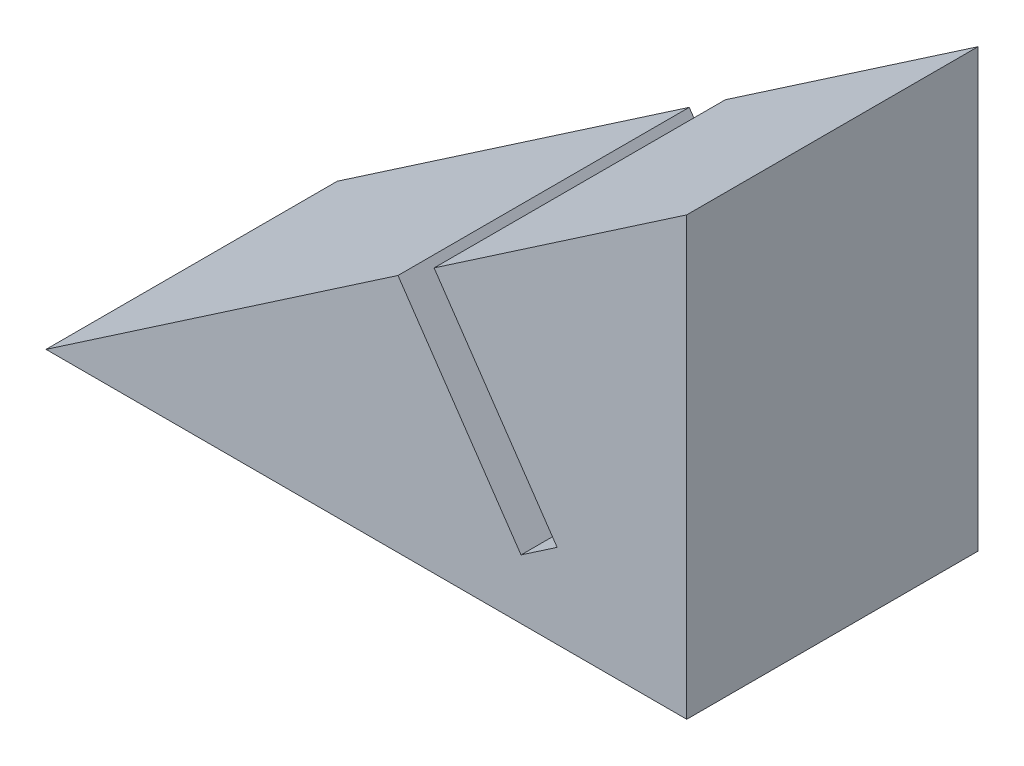
ISO-10303-21;
HEADER;
FILE_DESCRIPTION(('STEP AP214'),'2;1');
FILE_NAME('part.step','',(''),(''),'','','');
FILE_SCHEMA(('AUTOMOTIVE_DESIGN { 1 0 10303 214 1 1 1 1 }'));
ENDSEC;
DATA;
#1=APPLICATION_CONTEXT('core data for automotive mechanical design processes');
#2=APPLICATION_PROTOCOL_DEFINITION('international standard','automotive_design',2000,#1);
#3=PRODUCT_CONTEXT('',#1,'mechanical');
#4=PRODUCT('Part','Part','',(#3));
#5=PRODUCT_RELATED_PRODUCT_CATEGORY('part','',(#4));
#6=PRODUCT_DEFINITION_FORMATION('','',#4);
#7=PRODUCT_DEFINITION_CONTEXT('part definition',#1,'design');
#8=PRODUCT_DEFINITION('design','',#6,#7);
#9=PRODUCT_DEFINITION_SHAPE('','',#8);
#10=(LENGTH_UNIT() NAMED_UNIT(*) SI_UNIT(.MILLI.,.METRE.));
#11=(NAMED_UNIT(*) PLANE_ANGLE_UNIT() SI_UNIT($,.RADIAN.));
#12=(NAMED_UNIT(*) SI_UNIT($,.STERADIAN.) SOLID_ANGLE_UNIT());
#13=UNCERTAINTY_MEASURE_WITH_UNIT(LENGTH_MEASURE(1.E-05),#10,'distance_accuracy_value','');
#14=(GEOMETRIC_REPRESENTATION_CONTEXT(3) GLOBAL_UNCERTAINTY_ASSIGNED_CONTEXT((#13)) GLOBAL_UNIT_ASSIGNED_CONTEXT((#10,
#11,#12)) REPRESENTATION_CONTEXT('',''));
#15=CARTESIAN_POINT('',(0.,0.,0.));
#16=DIRECTION('',(0.,0.,1.));
#17=DIRECTION('',(1.,0.,0.));
#18=AXIS2_PLACEMENT_3D('',#15,#16,#17);
#19=CARTESIAN_POINT('',(-22.,0.,10.));
#20=DIRECTION('',(0.,1.,0.));
#21=DIRECTION('',(0.,0.,1.));
#22=AXIS2_PLACEMENT_3D('',#19,#20,#21);
#23=PLANE('',#22);
#24=DIRECTION('',(1.,0.,0.));
#25=VECTOR('',#24,1.);
#26=CARTESIAN_POINT('',(-22.,0.,0.));
#27=LINE('',#26,#25);
#28=CARTESIAN_POINT('',(-22.,0.,0.));
#29=VERTEX_POINT('',#28);
#30=CARTESIAN_POINT('',(0.,0.,0.));
#31=VERTEX_POINT('',#30);
#32=EDGE_CURVE('E134',#29,#31,#27,.T.);
#33=ORIENTED_EDGE('',*,*,#32,.T.);
#34=DIRECTION('',(0.,0.,-1.));
#35=VECTOR('',#34,1.);
#36=CARTESIAN_POINT('',(0.,0.,10.));
#37=LINE('',#36,#35);
#38=CARTESIAN_POINT('',(0.,0.,10.));
#39=VERTEX_POINT('',#38);
#40=EDGE_CURVE('E11',#39,#31,#37,.T.);
#41=ORIENTED_EDGE('',*,*,#40,.F.);
#42=DIRECTION('',(1.,0.,0.));
#43=VECTOR('',#42,1.);
#44=CARTESIAN_POINT('',(-22.,0.,10.));
#45=LINE('',#44,#43);
#46=CARTESIAN_POINT('',(-22.,0.,10.));
#47=VERTEX_POINT('',#46);
#48=EDGE_CURVE('E153',#47,#39,#45,.T.);
#49=ORIENTED_EDGE('',*,*,#48,.F.);
#50=DIRECTION('',(0.,0.,-1.));
#51=VECTOR('',#50,1.);
#52=CARTESIAN_POINT('',(-22.,0.,10.));
#53=LINE('',#52,#51);
#54=EDGE_CURVE('E130',#47,#29,#53,.T.);
#55=ORIENTED_EDGE('',*,*,#54,.T.);
#56=EDGE_LOOP('',(#33,#41,#49,#55));
#57=FACE_BOUND('',#56,.T.);
#58=ADVANCED_FACE('F39',(#57),#23,.F.);
#59=CARTESIAN_POINT('',(0.,0.,10.));
#60=DIRECTION('',(-1.,0.,0.));
#61=DIRECTION('',(0.,0.,1.));
#62=AXIS2_PLACEMENT_3D('',#59,#60,#61);
#63=PLANE('',#62);
#64=DIRECTION('',(0.,1.,0.));
#65=VECTOR('',#64,1.);
#66=CARTESIAN_POINT('',(0.,0.,0.));
#67=LINE('',#66,#65);
#68=CARTESIAN_POINT('',(0.,15.,0.));
#69=VERTEX_POINT('',#68);
#70=EDGE_CURVE('E138',#31,#69,#67,.T.);
#71=ORIENTED_EDGE('',*,*,#70,.T.);
#72=DIRECTION('',(0.,0.,-1.));
#73=VECTOR('',#72,1.);
#74=CARTESIAN_POINT('',(0.,15.,10.));
#75=LINE('',#74,#73);
#76=CARTESIAN_POINT('',(0.,15.,10.));
#77=VERTEX_POINT('',#76);
#78=EDGE_CURVE('E48',#77,#69,#75,.T.);
#79=ORIENTED_EDGE('',*,*,#78,.F.);
#80=DIRECTION('',(0.,1.,0.));
#81=VECTOR('',#80,1.);
#82=CARTESIAN_POINT('',(0.,0.,10.));
#83=LINE('',#82,#81);
#84=EDGE_CURVE('E96',#39,#77,#83,.T.);
#85=ORIENTED_EDGE('',*,*,#84,.F.);
#86=ORIENTED_EDGE('',*,*,#40,.T.);
#87=EDGE_LOOP('',(#71,#79,#85,#86));
#88=FACE_BOUND('',#87,.T.);
#89=ADVANCED_FACE('F187',(#88),#63,.F.);
#90=CARTESIAN_POINT('',(0.,15.,10.));
#91=DIRECTION('',(0.56333682464151,-0.826227342807548,0.));
#92=DIRECTION('',(0.826227342807548,0.56333682464151,0.));
#93=AXIS2_PLACEMENT_3D('',#90,#91,#92);
#94=PLANE('',#93);
#95=DIRECTION('',(-0.826227342807548,-0.56333682464151,0.));
#96=VECTOR('',#95,1.);
#97=CARTESIAN_POINT('',(0.,15.,0.));
#98=LINE('',#97,#96);
#99=CARTESIAN_POINT('',(-8.67538709947925,9.08496334126415,0.));
#100=VERTEX_POINT('',#99);
#101=EDGE_CURVE('E141',#69,#100,#98,.T.);
#102=ORIENTED_EDGE('',*,*,#101,.T.);
#103=DIRECTION('',(0.,0.,-1.));
#104=VECTOR('',#103,1.);
#105=CARTESIAN_POINT('',(-8.67538709947925,9.08496334126415,10.));
#106=LINE('',#105,#104);
#107=CARTESIAN_POINT('',(-8.67538709947925,9.08496334126415,10.));
#108=VERTEX_POINT('',#107);
#109=EDGE_CURVE('E160',#108,#100,#106,.T.);
#110=ORIENTED_EDGE('',*,*,#109,.F.);
#111=DIRECTION('',(-0.826227342807548,-0.56333682464151,0.));
#112=VECTOR('',#111,1.);
#113=CARTESIAN_POINT('',(0.,15.,10.));
#114=LINE('',#113,#112);
#115=EDGE_CURVE('E170',#77,#108,#114,.T.);
#116=ORIENTED_EDGE('',*,*,#115,.F.);
#117=ORIENTED_EDGE('',*,*,#78,.T.);
#118=EDGE_LOOP('',(#102,#110,#116,#117));
#119=FACE_BOUND('',#118,.T.);
#120=ADVANCED_FACE('F168',(#119),#94,.F.);
#121=CARTESIAN_POINT('',(-8.67538709947925,9.08496334126415,10.));
#122=DIRECTION('',(0.826227342807548,0.56333682464151,0.));
#123=DIRECTION('',(-0.56333682464151,0.826227342807548,0.));
#124=AXIS2_PLACEMENT_3D('',#121,#122,#123);
#125=PLANE('',#124);
#126=DIRECTION('',(0.56333682464151,-0.826227342807548,0.));
#127=VECTOR('',#126,1.);
#128=CARTESIAN_POINT('',(-8.67538709947925,9.08496334126415,0.));
#129=LINE('',#128,#127);
#130=CARTESIAN_POINT('',(-4.45036091466793,2.88825827020754,0.));
#131=VERTEX_POINT('',#130);
#132=EDGE_CURVE('E144',#100,#131,#129,.T.);
#133=ORIENTED_EDGE('',*,*,#132,.T.);
#134=DIRECTION('',(0.,0.,-1.));
#135=VECTOR('',#134,1.);
#136=CARTESIAN_POINT('',(-4.45036091466793,2.88825827020754,10.));
#137=LINE('',#136,#135);
#138=CARTESIAN_POINT('',(-4.45036091466793,2.88825827020754,10.));
#139=VERTEX_POINT('',#138);
#140=EDGE_CURVE('E123',#139,#131,#137,.T.);
#141=ORIENTED_EDGE('',*,*,#140,.F.);
#142=DIRECTION('',(0.56333682464151,-0.826227342807548,0.));
#143=VECTOR('',#142,1.);
#144=CARTESIAN_POINT('',(-8.67538709947925,9.08496334126415,10.));
#145=LINE('',#144,#143);
#146=EDGE_CURVE('E112',#108,#139,#145,.T.);
#147=ORIENTED_EDGE('',*,*,#146,.F.);
#148=ORIENTED_EDGE('',*,*,#109,.T.);
#149=EDGE_LOOP('',(#133,#141,#147,#148));
#150=FACE_BOUND('',#149,.T.);
#151=ADVANCED_FACE('F176',(#150),#125,.F.);
#152=CARTESIAN_POINT('',(-4.45036091466793,2.88825827020754,10.));
#153=DIRECTION('',(0.56333682464151,-0.826227342807548,0.));
#154=DIRECTION('',(0.826227342807548,0.56333682464151,0.));
#155=AXIS2_PLACEMENT_3D('',#152,#153,#154);
#156=PLANE('',#155);
#157=DIRECTION('',(-0.826227342807548,-0.56333682464151,0.));
#158=VECTOR('',#157,1.);
#159=CARTESIAN_POINT('',(-4.45036091466793,2.88825827020754,0.));
#160=LINE('',#159,#158);
#161=CARTESIAN_POINT('',(-5.68970192887925,2.04325303324527,0.));
#162=VERTEX_POINT('',#161);
#163=EDGE_CURVE('E121',#131,#162,#160,.T.);
#164=ORIENTED_EDGE('',*,*,#163,.T.);
#165=DIRECTION('',(0.,0.,-1.));
#166=VECTOR('',#165,1.);
#167=CARTESIAN_POINT('',(-5.68970192887925,2.04325303324527,10.));
#168=LINE('',#167,#166);
#169=CARTESIAN_POINT('',(-5.68970192887925,2.04325303324527,10.));
#170=VERTEX_POINT('',#169);
#171=EDGE_CURVE('E118',#170,#162,#168,.T.);
#172=ORIENTED_EDGE('',*,*,#171,.F.);
#173=DIRECTION('',(-0.826227342807548,-0.56333682464151,0.));
#174=VECTOR('',#173,1.);
#175=CARTESIAN_POINT('',(-4.45036091466793,2.88825827020754,10.));
#176=LINE('',#175,#174);
#177=EDGE_CURVE('E106',#139,#170,#176,.T.);
#178=ORIENTED_EDGE('',*,*,#177,.F.);
#179=ORIENTED_EDGE('',*,*,#140,.T.);
#180=EDGE_LOOP('',(#164,#172,#178,#179));
#181=FACE_BOUND('',#180,.T.);
#182=ADVANCED_FACE('F119',(#181),#156,.F.);
#183=CARTESIAN_POINT('',(-5.68970192887925,2.04325303324527,10.));
#184=DIRECTION('',(-0.826227342807548,-0.56333682464151,0.));
#185=DIRECTION('',(0.56333682464151,-0.826227342807548,0.));
#186=AXIS2_PLACEMENT_3D('',#183,#184,#185);
#187=PLANE('',#186);
#188=DIRECTION('',(-0.56333682464151,0.826227342807548,0.));
#189=VECTOR('',#188,1.);
#190=CARTESIAN_POINT('',(-5.68970192887925,2.04325303324527,0.));
#191=LINE('',#190,#189);
#192=CARTESIAN_POINT('',(-9.91472811369057,8.23995810430188,0.));
#193=VERTEX_POINT('',#192);
#194=EDGE_CURVE('E82',#162,#193,#191,.T.);
#195=ORIENTED_EDGE('',*,*,#194,.T.);
#196=DIRECTION('',(0.,0.,-1.));
#197=VECTOR('',#196,1.);
#198=CARTESIAN_POINT('',(-9.91472811369057,8.23995810430188,10.));
#199=LINE('',#198,#197);
#200=CARTESIAN_POINT('',(-9.91472811369057,8.23995810430188,10.));
#201=VERTEX_POINT('',#200);
#202=EDGE_CURVE('E124',#201,#193,#199,.T.);
#203=ORIENTED_EDGE('',*,*,#202,.F.);
#204=DIRECTION('',(-0.56333682464151,0.826227342807548,0.));
#205=VECTOR('',#204,1.);
#206=CARTESIAN_POINT('',(-5.68970192887925,2.04325303324527,10.));
#207=LINE('',#206,#205);
#208=EDGE_CURVE('E110',#170,#201,#207,.T.);
#209=ORIENTED_EDGE('',*,*,#208,.F.);
#210=ORIENTED_EDGE('',*,*,#171,.T.);
#211=EDGE_LOOP('',(#195,#203,#209,#210));
#212=FACE_BOUND('',#211,.T.);
#213=ADVANCED_FACE('F126',(#212),#187,.F.);
#214=CARTESIAN_POINT('',(-9.91472811369057,8.23995810430188,10.));
#215=DIRECTION('',(0.56333682464151,-0.826227342807548,0.));
#216=DIRECTION('',(0.826227342807548,0.56333682464151,0.));
#217=AXIS2_PLACEMENT_3D('',#214,#215,#216);
#218=PLANE('',#217);
#219=DIRECTION('',(-0.826227342807548,-0.56333682464151,0.));
#220=VECTOR('',#219,1.);
#221=CARTESIAN_POINT('',(-9.91472811369057,8.23995810430188,0.));
#222=LINE('',#221,#220);
#223=EDGE_CURVE('E88',#193,#29,#222,.T.);
#224=ORIENTED_EDGE('',*,*,#223,.T.);
#225=ORIENTED_EDGE('',*,*,#54,.F.);
#226=DIRECTION('',(-0.826227342807548,-0.56333682464151,0.));
#227=VECTOR('',#226,1.);
#228=CARTESIAN_POINT('',(-9.91472811369057,8.23995810430188,10.));
#229=LINE('',#228,#227);
#230=EDGE_CURVE('E56',#201,#47,#229,.T.);
#231=ORIENTED_EDGE('',*,*,#230,.F.);
#232=ORIENTED_EDGE('',*,*,#202,.T.);
#233=EDGE_LOOP('',(#224,#225,#231,#232));
#234=FACE_BOUND('',#233,.T.);
#235=ADVANCED_FACE('F201',(#234),#218,.F.);
#236=CARTESIAN_POINT('',(0.,0.,10.));
#237=DIRECTION('',(0.,0.,1.));
#238=DIRECTION('',(1.,0.,0.));
#239=AXIS2_PLACEMENT_3D('',#236,#237,#238);
#240=PLANE('',#239);
#241=ORIENTED_EDGE('',*,*,#48,.T.);
#242=ORIENTED_EDGE('',*,*,#84,.T.);
#243=ORIENTED_EDGE('',*,*,#115,.T.);
#244=ORIENTED_EDGE('',*,*,#146,.T.);
#245=ORIENTED_EDGE('',*,*,#177,.T.);
#246=ORIENTED_EDGE('',*,*,#208,.T.);
#247=ORIENTED_EDGE('',*,*,#230,.T.);
#248=EDGE_LOOP('',(#241,#242,#243,#244,#245,#246,#247));
#249=FACE_BOUND('',#248,.T.);
#250=ADVANCED_FACE('F108',(#249),#240,.T.);
#251=CARTESIAN_POINT('',(0.,0.,0.));
#252=DIRECTION('',(0.,0.,1.));
#253=DIRECTION('',(1.,0.,0.));
#254=AXIS2_PLACEMENT_3D('',#251,#252,#253);
#255=PLANE('',#254);
#256=ORIENTED_EDGE('',*,*,#32,.F.);
#257=ORIENTED_EDGE('',*,*,#223,.F.);
#258=ORIENTED_EDGE('',*,*,#194,.F.);
#259=ORIENTED_EDGE('',*,*,#163,.F.);
#260=ORIENTED_EDGE('',*,*,#132,.F.);
#261=ORIENTED_EDGE('',*,*,#101,.F.);
#262=ORIENTED_EDGE('',*,*,#70,.F.);
#263=EDGE_LOOP('',(#256,#257,#258,#259,#260,#261,#262));
#264=FACE_BOUND('',#263,.T.);
#265=ADVANCED_FACE('F174',(#264),#255,.F.);
#266=CLOSED_SHELL('',(#58,#89,#120,#151,#182,#213,#235,#250,#265));
#267=MANIFOLD_SOLID_BREP('B2',#266);
#268=ADVANCED_BREP_SHAPE_REPRESENTATION('',(#18,#267),#14);
#269=SHAPE_DEFINITION_REPRESENTATION(#9,#268);
ENDSEC;
END-ISO-10303-21;
